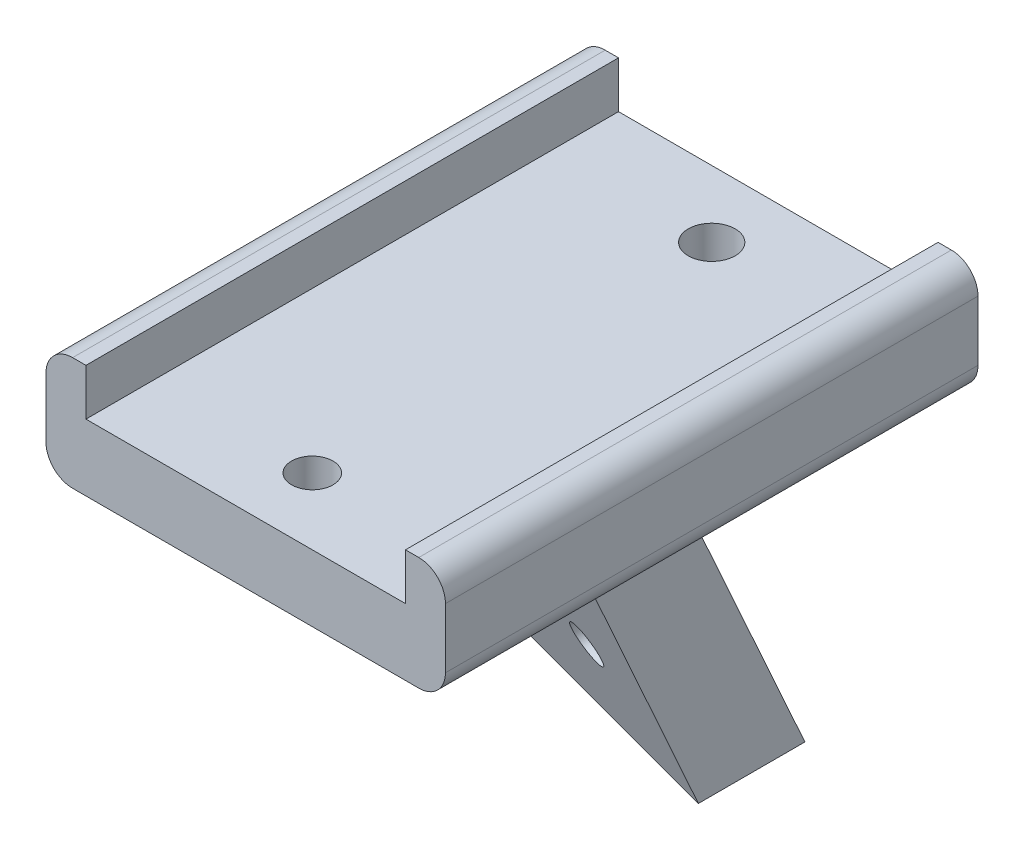
ISO-10303-21;
HEADER;
FILE_DESCRIPTION(('STEP AP214'),'2;1');
FILE_NAME('part.step','',(''),(''),'','','');
FILE_SCHEMA(('AUTOMOTIVE_DESIGN { 1 0 10303 214 1 1 1 1 }'));
ENDSEC;
DATA;
#1=APPLICATION_CONTEXT('core data for automotive mechanical design processes');
#2=APPLICATION_PROTOCOL_DEFINITION('international standard','automotive_design',2000,#1);
#3=PRODUCT_CONTEXT('',#1,'mechanical');
#4=PRODUCT('Part','Part','',(#3));
#5=PRODUCT_RELATED_PRODUCT_CATEGORY('part','',(#4));
#6=PRODUCT_DEFINITION_FORMATION('','',#4);
#7=PRODUCT_DEFINITION_CONTEXT('part definition',#1,'design');
#8=PRODUCT_DEFINITION('design','',#6,#7);
#9=PRODUCT_DEFINITION_SHAPE('','',#8);
#10=(LENGTH_UNIT() NAMED_UNIT(*) SI_UNIT(.MILLI.,.METRE.));
#11=(NAMED_UNIT(*) PLANE_ANGLE_UNIT() SI_UNIT($,.RADIAN.));
#12=(NAMED_UNIT(*) SI_UNIT($,.STERADIAN.) SOLID_ANGLE_UNIT());
#13=UNCERTAINTY_MEASURE_WITH_UNIT(LENGTH_MEASURE(1.E-05),#10,'distance_accuracy_value','');
#14=(GEOMETRIC_REPRESENTATION_CONTEXT(3) GLOBAL_UNCERTAINTY_ASSIGNED_CONTEXT((#13)) GLOBAL_UNIT_ASSIGNED_CONTEXT((#10,
#11,#12)) REPRESENTATION_CONTEXT('',''));
#15=CARTESIAN_POINT('',(0.,0.,0.));
#16=DIRECTION('',(0.,0.,1.));
#17=DIRECTION('',(1.,0.,0.));
#18=AXIS2_PLACEMENT_3D('',#15,#16,#17);
#19=CARTESIAN_POINT('',(0.,0.,0.));
#20=DIRECTION('',(0.,-1.,0.));
#21=DIRECTION('',(0.,0.,-1.));
#22=AXIS2_PLACEMENT_3D('',#19,#20,#21);
#23=PLANE('',#22);
#24=CARTESIAN_POINT('',(0.,0.,-15.));
#25=DIRECTION('',(0.,1.,0.));
#26=DIRECTION('',(0.,0.,1.));
#27=AXIS2_PLACEMENT_3D('',#24,#25,#26);
#28=CIRCLE('',#27,1.76063104913238);
#29=CARTESIAN_POINT('',(0.,0.,-13.2393689508676));
#30=VERTEX_POINT('',#29);
#31=EDGE_CURVE('E478',#30,#30,#28,.T.);
#32=ORIENTED_EDGE('',*,*,#31,.T.);
#33=EDGE_LOOP('',(#32));
#34=FACE_BOUND('',#33,.T.);
#35=DIRECTION('',(-1.,0.,0.));
#36=VECTOR('',#35,1.);
#37=CARTESIAN_POINT('',(-11.,0.,-20.));
#38=LINE('',#37,#36);
#39=CARTESIAN_POINT('',(13.,0.,-20.));
#40=VERTEX_POINT('',#39);
#41=CARTESIAN_POINT('',(-13.,0.,-20.));
#42=VERTEX_POINT('',#41);
#43=EDGE_CURVE('E486',#40,#42,#38,.T.);
#44=ORIENTED_EDGE('',*,*,#43,.F.);
#45=DIRECTION('',(0.,0.,-1.));
#46=VECTOR('',#45,1.);
#47=CARTESIAN_POINT('',(13.,0.,0.));
#48=LINE('',#47,#46);
#49=CARTESIAN_POINT('',(13.,0.,20.));
#50=VERTEX_POINT('',#49);
#51=EDGE_CURVE('E396',#40,#50,#48,.F.);
#52=ORIENTED_EDGE('',*,*,#51,.T.);
#53=DIRECTION('',(1.,0.,0.));
#54=VECTOR('',#53,1.);
#55=CARTESIAN_POINT('',(-11.,0.,20.));
#56=LINE('',#55,#54);
#57=CARTESIAN_POINT('',(-13.,0.,20.));
#58=VERTEX_POINT('',#57);
#59=EDGE_CURVE('E493',#58,#50,#56,.T.);
#60=ORIENTED_EDGE('',*,*,#59,.F.);
#61=DIRECTION('',(0.,0.,-1.));
#62=VECTOR('',#61,1.);
#63=CARTESIAN_POINT('',(-13.,0.,0.));
#64=LINE('',#63,#62);
#65=EDGE_CURVE('E520',#58,#42,#64,.T.);
#66=ORIENTED_EDGE('',*,*,#65,.T.);
#67=EDGE_LOOP('',(#44,#52,#60,#66));
#68=FACE_BOUND('',#67,.T.);
#69=CARTESIAN_POINT('',(0.,0.,15.));
#70=DIRECTION('',(0.,1.,0.));
#71=DIRECTION('',(0.,0.,1.));
#72=AXIS2_PLACEMENT_3D('',#69,#70,#71);
#73=CIRCLE('',#72,1.55539885410863);
#74=CARTESIAN_POINT('',(0.,0.,16.5553988541086));
#75=VERTEX_POINT('',#74);
#76=EDGE_CURVE('E456',#75,#75,#73,.T.);
#77=ORIENTED_EDGE('',*,*,#76,.T.);
#78=EDGE_LOOP('',(#77));
#79=FACE_BOUND('',#78,.T.);
#80=DIRECTION('',(0.965925826289067,0.,0.258819045102525));
#81=VECTOR('',#80,1.);
#82=CARTESIAN_POINT('',(11.,0.,-2.));
#83=LINE('',#82,#81);
#84=CARTESIAN_POINT('',(-11.,0.,-7.89488223348481));
#85=VERTEX_POINT('',#84);
#86=CARTESIAN_POINT('',(11.,0.,-2.));
#87=VERTEX_POINT('',#86);
#88=EDGE_CURVE('E184',#85,#87,#83,.T.);
#89=ORIENTED_EDGE('',*,*,#88,.F.);
#90=DIRECTION('',(0.,0.,-1.));
#91=VECTOR('',#90,1.);
#92=CARTESIAN_POINT('',(-11.,0.,-7.89488223348481));
#93=LINE('',#92,#91);
#94=CARTESIAN_POINT('',(-11.,0.,0.105117766515197));
#95=VERTEX_POINT('',#94);
#96=EDGE_CURVE('E194',#95,#85,#93,.T.);
#97=ORIENTED_EDGE('',*,*,#96,.F.);
#98=DIRECTION('',(-0.965925826289067,0.,-0.258819045102525));
#99=VECTOR('',#98,1.);
#100=CARTESIAN_POINT('',(-11.,0.,0.105117766515197));
#101=LINE('',#100,#99);
#102=CARTESIAN_POINT('',(11.,0.,6.));
#103=VERTEX_POINT('',#102);
#104=EDGE_CURVE('E190',#103,#95,#101,.T.);
#105=ORIENTED_EDGE('',*,*,#104,.F.);
#106=DIRECTION('',(0.,0.,1.));
#107=VECTOR('',#106,1.);
#108=CARTESIAN_POINT('',(11.,0.,6.));
#109=LINE('',#108,#107);
#110=EDGE_CURVE('E175',#87,#103,#109,.T.);
#111=ORIENTED_EDGE('',*,*,#110,.F.);
#112=EDGE_LOOP('',(#89,#97,#105,#111));
#113=FACE_BOUND('',#112,.T.);
#114=ADVANCED_FACE('F51',(#34,#68,#79,#113),#23,.T.);
#115=CARTESIAN_POINT('',(0.,5.,0.));
#116=DIRECTION('',(0.,-1.,0.));
#117=DIRECTION('',(0.,0.,-1.));
#118=AXIS2_PLACEMENT_3D('',#115,#116,#117);
#119=PLANE('',#118);
#120=DIRECTION('',(1.,0.,0.));
#121=VECTOR('',#120,1.);
#122=CARTESIAN_POINT('',(-11.,5.,20.));
#123=LINE('',#122,#121);
#124=CARTESIAN_POINT('',(-12.,5.,20.));
#125=VERTEX_POINT('',#124);
#126=CARTESIAN_POINT('',(12.,5.,20.));
#127=VERTEX_POINT('',#126);
#128=EDGE_CURVE('E492',#125,#127,#123,.T.);
#129=ORIENTED_EDGE('',*,*,#128,.T.);
#130=DIRECTION('',(0.,0.,-1.));
#131=VECTOR('',#130,1.);
#132=CARTESIAN_POINT('',(12.,5.,29.394147114028));
#133=LINE('',#132,#131);
#134=CARTESIAN_POINT('',(12.,5.,-20.));
#135=VERTEX_POINT('',#134);
#136=EDGE_CURVE('E468',#127,#135,#133,.T.);
#137=ORIENTED_EDGE('',*,*,#136,.T.);
#138=DIRECTION('',(-1.,0.,0.));
#139=VECTOR('',#138,1.);
#140=CARTESIAN_POINT('',(-11.,5.,-20.));
#141=LINE('',#140,#139);
#142=CARTESIAN_POINT('',(-12.,5.,-20.));
#143=VERTEX_POINT('',#142);
#144=EDGE_CURVE('E489',#135,#143,#141,.T.);
#145=ORIENTED_EDGE('',*,*,#144,.T.);
#146=DIRECTION('',(0.,0.,-1.));
#147=VECTOR('',#146,1.);
#148=CARTESIAN_POINT('',(-12.,5.,29.394147114028));
#149=LINE('',#148,#147);
#150=EDGE_CURVE('E418',#125,#143,#149,.T.);
#151=ORIENTED_EDGE('',*,*,#150,.F.);
#152=EDGE_LOOP('',(#129,#137,#145,#151));
#153=FACE_BOUND('',#152,.T.);
#154=CARTESIAN_POINT('',(0.,5.,-15.));
#155=DIRECTION('',(0.,1.,0.));
#156=DIRECTION('',(0.,0.,1.));
#157=AXIS2_PLACEMENT_3D('',#154,#155,#156);
#158=CIRCLE('',#157,1.76063104913238);
#159=CARTESIAN_POINT('',(0.,5.,-13.2393689508676));
#160=VERTEX_POINT('',#159);
#161=EDGE_CURVE('E482',#160,#160,#158,.T.);
#162=ORIENTED_EDGE('',*,*,#161,.F.);
#163=EDGE_LOOP('',(#162));
#164=FACE_BOUND('',#163,.T.);
#165=CARTESIAN_POINT('',(0.,5.,15.));
#166=DIRECTION('',(0.,1.,0.));
#167=DIRECTION('',(0.,0.,1.));
#168=AXIS2_PLACEMENT_3D('',#165,#166,#167);
#169=CIRCLE('',#168,1.55539885410863);
#170=CARTESIAN_POINT('',(0.,5.,16.5553988541086));
#171=VERTEX_POINT('',#170);
#172=EDGE_CURVE('E474',#171,#171,#169,.T.);
#173=ORIENTED_EDGE('',*,*,#172,.F.);
#174=EDGE_LOOP('',(#173));
#175=FACE_BOUND('',#174,.T.);
#176=ADVANCED_FACE('F345',(#153,#164,#175),#119,.F.);
#177=CARTESIAN_POINT('',(-11.,5.,-20.));
#178=DIRECTION('',(0.,0.,1.));
#179=DIRECTION('',(1.,0.,0.));
#180=AXIS2_PLACEMENT_3D('',#177,#178,#179);
#181=PLANE('',#180);
#182=DIRECTION('',(0.,-1.,0.));
#183=VECTOR('',#182,1.);
#184=CARTESIAN_POINT('',(15.,8.5,-20.));
#185=LINE('',#184,#183);
#186=CARTESIAN_POINT('',(15.,6.5,-20.));
#187=VERTEX_POINT('',#186);
#188=CARTESIAN_POINT('',(15.,2.,-20.));
#189=VERTEX_POINT('',#188);
#190=EDGE_CURVE('E464',#187,#189,#185,.T.);
#191=ORIENTED_EDGE('',*,*,#190,.T.);
#192=CARTESIAN_POINT('',(13.,2.,-20.));
#193=DIRECTION('',(0.,0.,1.));
#194=DIRECTION('',(1.,0.,0.));
#195=AXIS2_PLACEMENT_3D('',#192,#193,#194);
#196=CIRCLE('',#195,2.);
#197=EDGE_CURVE('E517',#189,#40,#196,.F.);
#198=ORIENTED_EDGE('',*,*,#197,.T.);
#199=ORIENTED_EDGE('',*,*,#43,.T.);
#200=CARTESIAN_POINT('',(-13.,2.,-20.));
#201=DIRECTION('',(0.,0.,1.));
#202=DIRECTION('',(1.,0.,0.));
#203=AXIS2_PLACEMENT_3D('',#200,#201,#202);
#204=CIRCLE('',#203,2.);
#205=CARTESIAN_POINT('',(-15.,2.,-20.));
#206=VERTEX_POINT('',#205);
#207=EDGE_CURVE('E514',#42,#206,#204,.F.);
#208=ORIENTED_EDGE('',*,*,#207,.T.);
#209=DIRECTION('',(0.,1.,0.));
#210=VECTOR('',#209,1.);
#211=CARTESIAN_POINT('',(-15.,8.5,-20.));
#212=LINE('',#211,#210);
#213=CARTESIAN_POINT('',(-15.,6.5,-20.));
#214=VERTEX_POINT('',#213);
#215=EDGE_CURVE('E305',#206,#214,#212,.T.);
#216=ORIENTED_EDGE('',*,*,#215,.T.);
#217=CARTESIAN_POINT('',(-13.,6.5,-20.));
#218=DIRECTION('',(0.,0.,1.));
#219=DIRECTION('',(1.,0.,0.));
#220=AXIS2_PLACEMENT_3D('',#217,#218,#219);
#221=CIRCLE('',#220,2.);
#222=CARTESIAN_POINT('',(-13.,8.5,-20.));
#223=VERTEX_POINT('',#222);
#224=EDGE_CURVE('E511',#214,#223,#221,.F.);
#225=ORIENTED_EDGE('',*,*,#224,.T.);
#226=DIRECTION('',(1.,0.,0.));
#227=VECTOR('',#226,1.);
#228=CARTESIAN_POINT('',(-12.,8.5,-20.));
#229=LINE('',#228,#227);
#230=CARTESIAN_POINT('',(-12.,8.5,-20.));
#231=VERTEX_POINT('',#230);
#232=EDGE_CURVE('E413',#223,#231,#229,.T.);
#233=ORIENTED_EDGE('',*,*,#232,.T.);
#234=DIRECTION('',(0.,-1.,0.));
#235=VECTOR('',#234,1.);
#236=CARTESIAN_POINT('',(-12.,5.,-20.));
#237=LINE('',#236,#235);
#238=EDGE_CURVE('E435',#231,#143,#237,.T.);
#239=ORIENTED_EDGE('',*,*,#238,.T.);
#240=ORIENTED_EDGE('',*,*,#144,.F.);
#241=DIRECTION('',(0.,1.,0.));
#242=VECTOR('',#241,1.);
#243=CARTESIAN_POINT('',(12.,5.,-20.));
#244=LINE('',#243,#242);
#245=CARTESIAN_POINT('',(12.,8.5,-20.));
#246=VERTEX_POINT('',#245);
#247=EDGE_CURVE('E443',#135,#246,#244,.T.);
#248=ORIENTED_EDGE('',*,*,#247,.T.);
#249=DIRECTION('',(1.,0.,0.));
#250=VECTOR('',#249,1.);
#251=CARTESIAN_POINT('',(12.,8.5,-20.));
#252=LINE('',#251,#250);
#253=CARTESIAN_POINT('',(13.,8.5,-20.));
#254=VERTEX_POINT('',#253);
#255=EDGE_CURVE('E460',#246,#254,#252,.T.);
#256=ORIENTED_EDGE('',*,*,#255,.T.);
#257=CARTESIAN_POINT('',(13.,6.5,-20.));
#258=DIRECTION('',(0.,0.,1.));
#259=DIRECTION('',(1.,0.,0.));
#260=AXIS2_PLACEMENT_3D('',#257,#258,#259);
#261=CIRCLE('',#260,2.);
#262=EDGE_CURVE('E508',#254,#187,#261,.F.);
#263=ORIENTED_EDGE('',*,*,#262,.T.);
#264=EDGE_LOOP('',(#191,#198,#199,#208,#216,#225,#233,#239,#240,#248,#256,#263));
#265=FACE_BOUND('',#264,.T.);
#266=ADVANCED_FACE('F351',(#265),#181,.F.);
#267=CARTESIAN_POINT('',(-11.,5.,20.));
#268=DIRECTION('',(0.,0.,-1.));
#269=DIRECTION('',(-1.,0.,0.));
#270=AXIS2_PLACEMENT_3D('',#267,#268,#269);
#271=PLANE('',#270);
#272=ORIENTED_EDGE('',*,*,#59,.T.);
#273=CARTESIAN_POINT('',(13.,2.,20.));
#274=DIRECTION('',(0.,0.,-1.));
#275=DIRECTION('',(-1.,0.,0.));
#276=AXIS2_PLACEMENT_3D('',#273,#274,#275);
#277=CIRCLE('',#276,2.);
#278=CARTESIAN_POINT('',(15.,2.,20.));
#279=VERTEX_POINT('',#278);
#280=EDGE_CURVE('E394',#50,#279,#277,.F.);
#281=ORIENTED_EDGE('',*,*,#280,.T.);
#282=DIRECTION('',(0.,1.,0.));
#283=VECTOR('',#282,1.);
#284=CARTESIAN_POINT('',(15.,8.5,20.));
#285=LINE('',#284,#283);
#286=CARTESIAN_POINT('',(15.,6.5,20.));
#287=VERTEX_POINT('',#286);
#288=EDGE_CURVE('E452',#279,#287,#285,.T.);
#289=ORIENTED_EDGE('',*,*,#288,.T.);
#290=CARTESIAN_POINT('',(13.,6.5,20.));
#291=DIRECTION('',(0.,0.,-1.));
#292=DIRECTION('',(-1.,0.,0.));
#293=AXIS2_PLACEMENT_3D('',#290,#291,#292);
#294=CIRCLE('',#293,2.);
#295=CARTESIAN_POINT('',(13.,8.5,20.));
#296=VERTEX_POINT('',#295);
#297=EDGE_CURVE('E390',#287,#296,#294,.F.);
#298=ORIENTED_EDGE('',*,*,#297,.T.);
#299=DIRECTION('',(-1.,0.,0.));
#300=VECTOR('',#299,1.);
#301=CARTESIAN_POINT('',(12.,8.5,20.));
#302=LINE('',#301,#300);
#303=CARTESIAN_POINT('',(12.,8.5,20.));
#304=VERTEX_POINT('',#303);
#305=EDGE_CURVE('E448',#296,#304,#302,.T.);
#306=ORIENTED_EDGE('',*,*,#305,.T.);
#307=DIRECTION('',(0.,-1.,0.));
#308=VECTOR('',#307,1.);
#309=CARTESIAN_POINT('',(12.,5.,20.));
#310=LINE('',#309,#308);
#311=EDGE_CURVE('E444',#304,#127,#310,.T.);
#312=ORIENTED_EDGE('',*,*,#311,.T.);
#313=ORIENTED_EDGE('',*,*,#128,.F.);
#314=DIRECTION('',(0.,1.,0.));
#315=VECTOR('',#314,1.);
#316=CARTESIAN_POINT('',(-12.,5.,20.));
#317=LINE('',#316,#315);
#318=CARTESIAN_POINT('',(-12.,8.5,20.));
#319=VERTEX_POINT('',#318);
#320=EDGE_CURVE('E416',#125,#319,#317,.T.);
#321=ORIENTED_EDGE('',*,*,#320,.T.);
#322=DIRECTION('',(-1.,0.,0.));
#323=VECTOR('',#322,1.);
#324=CARTESIAN_POINT('',(-12.,8.5,20.));
#325=LINE('',#324,#323);
#326=CARTESIAN_POINT('',(-13.,8.5,20.));
#327=VERTEX_POINT('',#326);
#328=EDGE_CURVE('E411',#319,#327,#325,.T.);
#329=ORIENTED_EDGE('',*,*,#328,.T.);
#330=CARTESIAN_POINT('',(-13.,6.5,20.));
#331=DIRECTION('',(0.,0.,-1.));
#332=DIRECTION('',(-1.,0.,0.));
#333=AXIS2_PLACEMENT_3D('',#330,#331,#332);
#334=CIRCLE('',#333,2.);
#335=CARTESIAN_POINT('',(-15.,6.5,20.));
#336=VERTEX_POINT('',#335);
#337=EDGE_CURVE('E384',#327,#336,#334,.F.);
#338=ORIENTED_EDGE('',*,*,#337,.T.);
#339=DIRECTION('',(0.,-1.,0.));
#340=VECTOR('',#339,1.);
#341=CARTESIAN_POINT('',(-15.,8.5,20.));
#342=LINE('',#341,#340);
#343=CARTESIAN_POINT('',(-15.,2.,20.));
#344=VERTEX_POINT('',#343);
#345=EDGE_CURVE('E422',#336,#344,#342,.T.);
#346=ORIENTED_EDGE('',*,*,#345,.T.);
#347=CARTESIAN_POINT('',(-13.,2.,20.));
#348=DIRECTION('',(0.,0.,-1.));
#349=DIRECTION('',(-1.,0.,0.));
#350=AXIS2_PLACEMENT_3D('',#347,#348,#349);
#351=CIRCLE('',#350,2.);
#352=EDGE_CURVE('E389',#344,#58,#351,.F.);
#353=ORIENTED_EDGE('',*,*,#352,.T.);
#354=EDGE_LOOP('',(#272,#281,#289,#298,#306,#312,#313,#321,#329,#338,#346,#353));
#355=FACE_BOUND('',#354,.T.);
#356=ADVANCED_FACE('F358',(#355),#271,.F.);
#357=CARTESIAN_POINT('',(0.,5.,-15.));
#358=DIRECTION('',(0.,-1.,0.));
#359=DIRECTION('',(0.,0.,-1.));
#360=AXIS2_PLACEMENT_3D('',#357,#358,#359);
#361=CYLINDRICAL_SURFACE('',#360,1.76063104913238);
#362=ORIENTED_EDGE('',*,*,#161,.T.);
#363=EDGE_LOOP('',(#362));
#364=FACE_BOUND('',#363,.T.);
#365=ORIENTED_EDGE('',*,*,#31,.F.);
#366=EDGE_LOOP('',(#365));
#367=FACE_BOUND('',#366,.T.);
#368=ADVANCED_FACE('F361',(#364,#367),#361,.F.);
#369=CARTESIAN_POINT('',(0.,5.,15.));
#370=DIRECTION('',(0.,-1.,0.));
#371=DIRECTION('',(0.,0.,-1.));
#372=AXIS2_PLACEMENT_3D('',#369,#370,#371);
#373=CYLINDRICAL_SURFACE('',#372,1.55539885410863);
#374=ORIENTED_EDGE('',*,*,#172,.T.);
#375=EDGE_LOOP('',(#374));
#376=FACE_BOUND('',#375,.T.);
#377=ORIENTED_EDGE('',*,*,#76,.F.);
#378=EDGE_LOOP('',(#377));
#379=FACE_BOUND('',#378,.T.);
#380=ADVANCED_FACE('F561',(#376,#379),#373,.F.);
#381=CARTESIAN_POINT('',(15.,8.5,29.394147114028));
#382=DIRECTION('',(1.,0.,0.));
#383=DIRECTION('',(0.,1.,0.));
#384=AXIS2_PLACEMENT_3D('',#381,#382,#383);
#385=PLANE('',#384);
#386=ORIENTED_EDGE('',*,*,#288,.F.);
#387=DIRECTION('',(0.,0.,-1.));
#388=VECTOR('',#387,1.);
#389=CARTESIAN_POINT('',(15.,2.,29.394147114028));
#390=LINE('',#389,#388);
#391=EDGE_CURVE('E504',#279,#189,#390,.T.);
#392=ORIENTED_EDGE('',*,*,#391,.T.);
#393=ORIENTED_EDGE('',*,*,#190,.F.);
#394=DIRECTION('',(0.,0.,-1.));
#395=VECTOR('',#394,1.);
#396=CARTESIAN_POINT('',(15.,6.5,29.394147114028));
#397=LINE('',#396,#395);
#398=EDGE_CURVE('E496',#187,#287,#397,.F.);
#399=ORIENTED_EDGE('',*,*,#398,.T.);
#400=EDGE_LOOP('',(#386,#392,#393,#399));
#401=FACE_BOUND('',#400,.T.);
#402=ADVANCED_FACE('F535',(#401),#385,.T.);
#403=CARTESIAN_POINT('',(12.,8.5,29.394147114028));
#404=DIRECTION('',(0.,1.,0.));
#405=DIRECTION('',(0.,0.,1.));
#406=AXIS2_PLACEMENT_3D('',#403,#404,#405);
#407=PLANE('',#406);
#408=ORIENTED_EDGE('',*,*,#305,.F.);
#409=DIRECTION('',(0.,0.,-1.));
#410=VECTOR('',#409,1.);
#411=CARTESIAN_POINT('',(13.,8.5,29.394147114028));
#412=LINE('',#411,#410);
#413=EDGE_CURVE('E12',#296,#254,#412,.T.);
#414=ORIENTED_EDGE('',*,*,#413,.T.);
#415=ORIENTED_EDGE('',*,*,#255,.F.);
#416=DIRECTION('',(0.,0.,-1.));
#417=VECTOR('',#416,1.);
#418=CARTESIAN_POINT('',(12.,8.5,29.394147114028));
#419=LINE('',#418,#417);
#420=EDGE_CURVE('E449',#304,#246,#419,.T.);
#421=ORIENTED_EDGE('',*,*,#420,.F.);
#422=EDGE_LOOP('',(#408,#414,#415,#421));
#423=FACE_BOUND('',#422,.T.);
#424=ADVANCED_FACE('F542',(#423),#407,.T.);
#425=CARTESIAN_POINT('',(12.,5.,29.394147114028));
#426=DIRECTION('',(-1.,0.,0.));
#427=DIRECTION('',(0.,0.,1.));
#428=AXIS2_PLACEMENT_3D('',#425,#426,#427);
#429=PLANE('',#428);
#430=ORIENTED_EDGE('',*,*,#311,.F.);
#431=ORIENTED_EDGE('',*,*,#420,.T.);
#432=ORIENTED_EDGE('',*,*,#247,.F.);
#433=ORIENTED_EDGE('',*,*,#136,.F.);
#434=EDGE_LOOP('',(#430,#431,#432,#433));
#435=FACE_BOUND('',#434,.T.);
#436=ADVANCED_FACE('F547',(#435),#429,.T.);
#437=CARTESIAN_POINT('',(-12.,5.,29.394147114028));
#438=DIRECTION('',(1.,0.,0.));
#439=DIRECTION('',(0.,0.,-1.));
#440=AXIS2_PLACEMENT_3D('',#437,#438,#439);
#441=PLANE('',#440);
#442=ORIENTED_EDGE('',*,*,#320,.F.);
#443=ORIENTED_EDGE('',*,*,#150,.T.);
#444=ORIENTED_EDGE('',*,*,#238,.F.);
#445=DIRECTION('',(0.,0.,-1.));
#446=VECTOR('',#445,1.);
#447=CARTESIAN_POINT('',(-12.,8.5,29.394147114028));
#448=LINE('',#447,#446);
#449=EDGE_CURVE('E425',#319,#231,#448,.T.);
#450=ORIENTED_EDGE('',*,*,#449,.F.);
#451=EDGE_LOOP('',(#442,#443,#444,#450));
#452=FACE_BOUND('',#451,.T.);
#453=ADVANCED_FACE('F269',(#452),#441,.T.);
#454=CARTESIAN_POINT('',(-12.,8.5,29.394147114028));
#455=DIRECTION('',(0.,1.,0.));
#456=DIRECTION('',(0.,0.,1.));
#457=AXIS2_PLACEMENT_3D('',#454,#455,#456);
#458=PLANE('',#457);
#459=ORIENTED_EDGE('',*,*,#232,.F.);
#460=DIRECTION('',(0.,0.,-1.));
#461=VECTOR('',#460,1.);
#462=CARTESIAN_POINT('',(-13.,8.5,29.394147114028));
#463=LINE('',#462,#461);
#464=EDGE_CURVE('E61',#223,#327,#463,.F.);
#465=ORIENTED_EDGE('',*,*,#464,.T.);
#466=ORIENTED_EDGE('',*,*,#328,.F.);
#467=ORIENTED_EDGE('',*,*,#449,.T.);
#468=EDGE_LOOP('',(#459,#465,#466,#467));
#469=FACE_BOUND('',#468,.T.);
#470=ADVANCED_FACE('F409',(#469),#458,.T.);
#471=CARTESIAN_POINT('',(-15.,8.5,29.394147114028));
#472=DIRECTION('',(-1.,0.,0.));
#473=DIRECTION('',(0.,-1.,0.));
#474=AXIS2_PLACEMENT_3D('',#471,#472,#473);
#475=PLANE('',#474);
#476=ORIENTED_EDGE('',*,*,#215,.F.);
#477=DIRECTION('',(0.,0.,-1.));
#478=VECTOR('',#477,1.);
#479=CARTESIAN_POINT('',(-15.,2.,29.394147114028));
#480=LINE('',#479,#478);
#481=EDGE_CURVE('E77',#206,#344,#480,.F.);
#482=ORIENTED_EDGE('',*,*,#481,.T.);
#483=ORIENTED_EDGE('',*,*,#345,.F.);
#484=DIRECTION('',(0.,0.,-1.));
#485=VECTOR('',#484,1.);
#486=CARTESIAN_POINT('',(-15.,6.5,29.394147114028));
#487=LINE('',#486,#485);
#488=EDGE_CURVE('E386',#336,#214,#487,.T.);
#489=ORIENTED_EDGE('',*,*,#488,.T.);
#490=EDGE_LOOP('',(#476,#482,#483,#489));
#491=FACE_BOUND('',#490,.T.);
#492=ADVANCED_FACE('F370',(#491),#475,.T.);
#493=CARTESIAN_POINT('',(13.,2.,29.394147114028));
#494=DIRECTION('',(0.,0.,-1.));
#495=DIRECTION('',(-1.,0.,0.));
#496=AXIS2_PLACEMENT_3D('',#493,#494,#495);
#497=CYLINDRICAL_SURFACE('',#496,2.);
#498=ORIENTED_EDGE('',*,*,#280,.F.);
#499=ORIENTED_EDGE('',*,*,#51,.F.);
#500=ORIENTED_EDGE('',*,*,#197,.F.);
#501=ORIENTED_EDGE('',*,*,#391,.F.);
#502=EDGE_LOOP('',(#498,#499,#500,#501));
#503=FACE_BOUND('',#502,.T.);
#504=ADVANCED_FACE('F366',(#503),#497,.T.);
#505=CARTESIAN_POINT('',(-13.,2.,0.));
#506=DIRECTION('',(0.,0.,-1.));
#507=DIRECTION('',(-1.,0.,0.));
#508=AXIS2_PLACEMENT_3D('',#505,#506,#507);
#509=CYLINDRICAL_SURFACE('',#508,2.);
#510=ORIENTED_EDGE('',*,*,#352,.F.);
#511=ORIENTED_EDGE('',*,*,#481,.F.);
#512=ORIENTED_EDGE('',*,*,#207,.F.);
#513=ORIENTED_EDGE('',*,*,#65,.F.);
#514=EDGE_LOOP('',(#510,#511,#512,#513));
#515=FACE_BOUND('',#514,.T.);
#516=ADVANCED_FACE('F369',(#515),#509,.T.);
#517=CARTESIAN_POINT('',(-13.,6.5,29.394147114028));
#518=DIRECTION('',(0.,0.,-1.));
#519=DIRECTION('',(-1.,0.,0.));
#520=AXIS2_PLACEMENT_3D('',#517,#518,#519);
#521=CYLINDRICAL_SURFACE('',#520,2.);
#522=ORIENTED_EDGE('',*,*,#337,.F.);
#523=ORIENTED_EDGE('',*,*,#464,.F.);
#524=ORIENTED_EDGE('',*,*,#224,.F.);
#525=ORIENTED_EDGE('',*,*,#488,.F.);
#526=EDGE_LOOP('',(#522,#523,#524,#525));
#527=FACE_BOUND('',#526,.T.);
#528=ADVANCED_FACE('F373',(#527),#521,.T.);
#529=CARTESIAN_POINT('',(13.,6.5,29.394147114028));
#530=DIRECTION('',(0.,0.,-1.));
#531=DIRECTION('',(-1.,0.,0.));
#532=AXIS2_PLACEMENT_3D('',#529,#530,#531);
#533=CYLINDRICAL_SURFACE('',#532,2.);
#534=ORIENTED_EDGE('',*,*,#297,.F.);
#535=ORIENTED_EDGE('',*,*,#398,.F.);
#536=ORIENTED_EDGE('',*,*,#262,.F.);
#537=ORIENTED_EDGE('',*,*,#413,.F.);
#538=EDGE_LOOP('',(#534,#535,#536,#537));
#539=FACE_BOUND('',#538,.T.);
#540=ADVANCED_FACE('F53',(#539),#533,.T.);
#541=CARTESIAN_POINT('',(0.,-20.,0.));
#542=DIRECTION('',(0.,1.,0.));
#543=DIRECTION('',(0.,0.,1.));
#544=AXIS2_PLACEMENT_3D('',#541,#542,#543);
#545=PLANE('',#544);
#546=DIRECTION('',(-0.965925826289069,0.,-0.258819045102518));
#547=VECTOR('',#546,1.);
#548=CARTESIAN_POINT('',(-11.,-20.,-8.89488223348463));
#549=LINE('',#548,#547);
#550=CARTESIAN_POINT('',(11.,-20.,-3.));
#551=VERTEX_POINT('',#550);
#552=CARTESIAN_POINT('',(-11.,-20.,-8.89488223348463));
#553=VERTEX_POINT('',#552);
#554=EDGE_CURVE('E228',#551,#553,#549,.T.);
#555=ORIENTED_EDGE('',*,*,#554,.T.);
#556=DIRECTION('',(0.,0.,-1.));
#557=VECTOR('',#556,1.);
#558=CARTESIAN_POINT('',(-11.,-20.,-16.8948822334846));
#559=LINE('',#558,#557);
#560=CARTESIAN_POINT('',(-11.,-20.,-16.8948822334846));
#561=VERTEX_POINT('',#560);
#562=EDGE_CURVE('E243',#553,#561,#559,.T.);
#563=ORIENTED_EDGE('',*,*,#562,.T.);
#564=DIRECTION('',(0.965925826289069,0.,0.258819045102518));
#565=VECTOR('',#564,1.);
#566=CARTESIAN_POINT('',(11.,-20.,-11.));
#567=LINE('',#566,#565);
#568=CARTESIAN_POINT('',(11.,-20.,-11.));
#569=VERTEX_POINT('',#568);
#570=EDGE_CURVE('E298',#561,#569,#567,.T.);
#571=ORIENTED_EDGE('',*,*,#570,.T.);
#572=DIRECTION('',(0.,0.,1.));
#573=VECTOR('',#572,1.);
#574=CARTESIAN_POINT('',(11.,-20.,-3.));
#575=LINE('',#574,#573);
#576=EDGE_CURVE('E177',#569,#551,#575,.T.);
#577=ORIENTED_EDGE('',*,*,#576,.T.);
#578=EDGE_LOOP('',(#555,#563,#571,#577));
#579=FACE_BOUND('',#578,.T.);
#580=ADVANCED_FACE('F264',(#579),#545,.F.);
#581=CARTESIAN_POINT('',(11.,0.,0.));
#582=DIRECTION('',(-1.,0.,0.));
#583=DIRECTION('',(0.,0.,1.));
#584=AXIS2_PLACEMENT_3D('',#581,#582,#583);
#585=PLANE('',#584);
#586=DIRECTION('',(0.,-0.911921505175106,-0.410364677328798));
#587=VECTOR('',#586,1.);
#588=CARTESIAN_POINT('',(11.,0.,6.));
#589=LINE('',#588,#587);
#590=EDGE_CURVE('E181',#103,#551,#589,.T.);
#591=ORIENTED_EDGE('',*,*,#590,.T.);
#592=ORIENTED_EDGE('',*,*,#576,.F.);
#593=DIRECTION('',(0.,-0.911921505175106,-0.410364677328798));
#594=VECTOR('',#593,1.);
#595=CARTESIAN_POINT('',(11.,0.,-2.));
#596=LINE('',#595,#594);
#597=EDGE_CURVE('E171',#87,#569,#596,.T.);
#598=ORIENTED_EDGE('',*,*,#597,.F.);
#599=ORIENTED_EDGE('',*,*,#110,.T.);
#600=EDGE_LOOP('',(#591,#592,#598,#599));
#601=FACE_BOUND('',#600,.T.);
#602=ADVANCED_FACE('F173',(#601),#585,.F.);
#603=CARTESIAN_POINT('',(1.04030935597384,1.74711931743764,-3.88248737208365));
#604=DIRECTION('',(-0.237365262193968,-0.398636648306913,0.885859218459807));
#605=DIRECTION('',(0.,-0.911921505175107,-0.410364677328798));
#606=AXIS2_PLACEMENT_3D('',#603,#604,#605);
#607=PLANE('',#606);
#608=CARTESIAN_POINT('',(6.14289764287496,-9.17108948068132,-7.4284469204535));
#609=DIRECTION('',(-0.237365262193975,-0.398636648306906,0.885859218459808));
#610=DIRECTION('',(0.,-0.911921505175109,-0.410364677328791));
#611=AXIS2_PLACEMENT_3D('',#608,#609,#610);
#612=CIRCLE('',#611,1.5);
#613=CARTESIAN_POINT('',(6.14289764287496,-10.538971738444,-8.04399393644669));
#614=VERTEX_POINT('',#613);
#615=EDGE_CURVE('E210',#614,#614,#612,.T.);
#616=ORIENTED_EDGE('',*,*,#615,.T.);
#617=EDGE_LOOP('',(#616));
#618=FACE_BOUND('',#617,.T.);
#619=CARTESIAN_POINT('',(-6.14289764287496,-9.17108948068132,-10.7204158456443));
#620=DIRECTION('',(-0.237365262193975,-0.398636648306906,0.885859218459808));
#621=DIRECTION('',(0.,-0.911921505175109,-0.410364677328791));
#622=AXIS2_PLACEMENT_3D('',#619,#620,#621);
#623=CIRCLE('',#622,1.5);
#624=CARTESIAN_POINT('',(-6.14289764287496,-10.538971738444,-11.3359628616375));
#625=VERTEX_POINT('',#624);
#626=EDGE_CURVE('E219',#625,#625,#623,.T.);
#627=ORIENTED_EDGE('',*,*,#626,.T.);
#628=EDGE_LOOP('',(#627));
#629=FACE_BOUND('',#628,.T.);
#630=ORIENTED_EDGE('',*,*,#597,.T.);
#631=ORIENTED_EDGE('',*,*,#570,.F.);
#632=DIRECTION('',(0.,-0.911921505175109,-0.410364677328791));
#633=VECTOR('',#632,1.);
#634=CARTESIAN_POINT('',(-11.,0.,-7.89488223348481));
#635=LINE('',#634,#633);
#636=EDGE_CURVE('E69',#85,#561,#635,.T.);
#637=ORIENTED_EDGE('',*,*,#636,.F.);
#638=ORIENTED_EDGE('',*,*,#88,.T.);
#639=EDGE_LOOP('',(#630,#631,#637,#638));
#640=FACE_BOUND('',#639,.T.);
#641=ADVANCED_FACE('F185',(#618,#629,#640),#607,.F.);
#642=CARTESIAN_POINT('',(-0.641868289279378,-1.07796828031107,2.39548506735798));
#643=DIRECTION('',(0.237365262193969,0.398636648306907,-0.885859218459809));
#644=DIRECTION('',(0.,0.911921505175109,0.410364677328792));
#645=AXIS2_PLACEMENT_3D('',#642,#643,#644);
#646=PLANE('',#645);
#647=CARTESIAN_POINT('',(4.46071999762168,-11.99617707843,-1.15047448101182));
#648=DIRECTION('',(0.237365262193969,0.398636648306907,-0.885859218459809));
#649=DIRECTION('',(0.,0.911921505175109,0.410364677328792));
#650=AXIS2_PLACEMENT_3D('',#647,#648,#649);
#651=CIRCLE('',#650,1.5);
#652=CARTESIAN_POINT('',(4.46071999762168,-10.6282948206674,-0.534927465018635));
#653=VERTEX_POINT('',#652);
#654=EDGE_CURVE('E202',#653,#653,#651,.T.);
#655=ORIENTED_EDGE('',*,*,#654,.T.);
#656=EDGE_LOOP('',(#655));
#657=FACE_BOUND('',#656,.T.);
#658=CARTESIAN_POINT('',(-7.82507528812826,-11.9961770784301,-4.44244340620259));
#659=DIRECTION('',(0.237365262193969,0.398636648306907,-0.885859218459809));
#660=DIRECTION('',(0.,0.911921505175109,0.410364677328792));
#661=AXIS2_PLACEMENT_3D('',#658,#659,#660);
#662=CIRCLE('',#661,1.5);
#663=CARTESIAN_POINT('',(-7.82507528812826,-10.6282948206674,-3.8268963902094));
#664=VERTEX_POINT('',#663);
#665=EDGE_CURVE('E216',#664,#664,#662,.T.);
#666=ORIENTED_EDGE('',*,*,#665,.T.);
#667=EDGE_LOOP('',(#666));
#668=FACE_BOUND('',#667,.T.);
#669=DIRECTION('',(0.,-0.911921505175109,-0.410364677328791));
#670=VECTOR('',#669,1.);
#671=CARTESIAN_POINT('',(-11.,0.,0.105117766515197));
#672=LINE('',#671,#670);
#673=EDGE_CURVE('E180',#95,#553,#672,.T.);
#674=ORIENTED_EDGE('',*,*,#673,.T.);
#675=ORIENTED_EDGE('',*,*,#554,.F.);
#676=ORIENTED_EDGE('',*,*,#590,.F.);
#677=ORIENTED_EDGE('',*,*,#104,.T.);
#678=EDGE_LOOP('',(#674,#675,#676,#677));
#679=FACE_BOUND('',#678,.T.);
#680=ADVANCED_FACE('F261',(#657,#668,#679),#646,.F.);
#681=CARTESIAN_POINT('',(-11.,0.,0.));
#682=DIRECTION('',(1.,0.,0.));
#683=DIRECTION('',(0.,1.,0.));
#684=AXIS2_PLACEMENT_3D('',#681,#682,#683);
#685=PLANE('',#684);
#686=ORIENTED_EDGE('',*,*,#636,.T.);
#687=ORIENTED_EDGE('',*,*,#562,.F.);
#688=ORIENTED_EDGE('',*,*,#673,.F.);
#689=ORIENTED_EDGE('',*,*,#96,.T.);
#690=EDGE_LOOP('',(#686,#687,#688,#689));
#691=FACE_BOUND('',#690,.T.);
#692=ADVANCED_FACE('F250',(#691),#685,.F.);
#693=CARTESIAN_POINT('',(-8.83213080722115,-13.6874491419138,-0.684061042905321));
#694=DIRECTION('',(0.237365262193975,0.398636648306906,-0.885859218459808));
#695=DIRECTION('',(0.,0.911921505175109,0.410364677328791));
#696=AXIS2_PLACEMENT_3D('',#693,#694,#695);
#697=CYLINDRICAL_SURFACE('',#696,1.5);
#698=ORIENTED_EDGE('',*,*,#665,.F.);
#699=EDGE_LOOP('',(#698));
#700=FACE_BOUND('',#699,.T.);
#701=ORIENTED_EDGE('',*,*,#626,.F.);
#702=EDGE_LOOP('',(#701));
#703=FACE_BOUND('',#702,.T.);
#704=ADVANCED_FACE('F260',(#700,#703),#697,.F.);
#705=CARTESIAN_POINT('',(3.45366447852877,-13.6874491419138,2.60790788228552));
#706=DIRECTION('',(0.237365262193975,0.398636648306906,-0.885859218459808));
#707=DIRECTION('',(0.,0.911921505175109,0.410364677328791));
#708=AXIS2_PLACEMENT_3D('',#705,#706,#707);
#709=CYLINDRICAL_SURFACE('',#708,1.5);
#710=ORIENTED_EDGE('',*,*,#654,.F.);
#711=EDGE_LOOP('',(#710));
#712=FACE_BOUND('',#711,.T.);
#713=ORIENTED_EDGE('',*,*,#615,.F.);
#714=EDGE_LOOP('',(#713));
#715=FACE_BOUND('',#714,.T.);
#716=ADVANCED_FACE('F677',(#712,#715),#709,.F.);
#717=CLOSED_SHELL('',(#114,#176,#266,#356,#368,#380,#402,#424,#436,#453,#470,#492,#504,#516,
#528,#540,#580,#602,#641,#680,#692,#704,#716));
#718=MANIFOLD_SOLID_BREP('B2',#717);
#719=ADVANCED_BREP_SHAPE_REPRESENTATION('',(#18,#718),#14);
#720=SHAPE_DEFINITION_REPRESENTATION(#9,#719);
ENDSEC;
END-ISO-10303-21;
